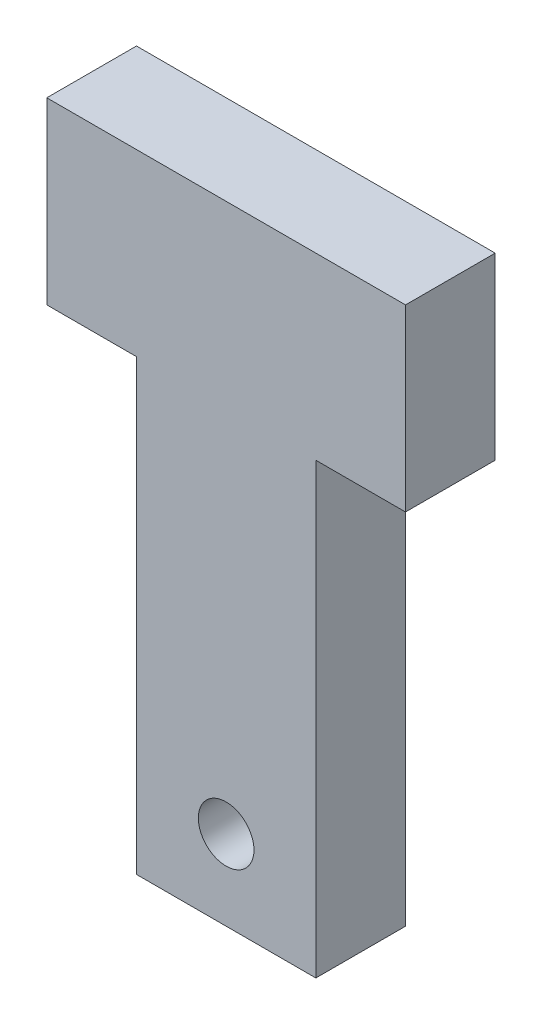
ISO-10303-21;
HEADER;
FILE_DESCRIPTION(('STEP AP214'),'2;1');
FILE_NAME('part.step','',(''),(''),'','','');
FILE_SCHEMA(('AUTOMOTIVE_DESIGN { 1 0 10303 214 1 1 1 1 }'));
ENDSEC;
DATA;
#1=APPLICATION_CONTEXT('core data for automotive mechanical design processes');
#2=APPLICATION_PROTOCOL_DEFINITION('international standard','automotive_design',2000,#1);
#3=PRODUCT_CONTEXT('',#1,'mechanical');
#4=PRODUCT('Part','Part','',(#3));
#5=PRODUCT_RELATED_PRODUCT_CATEGORY('part','',(#4));
#6=PRODUCT_DEFINITION_FORMATION('','',#4);
#7=PRODUCT_DEFINITION_CONTEXT('part definition',#1,'design');
#8=PRODUCT_DEFINITION('design','',#6,#7);
#9=PRODUCT_DEFINITION_SHAPE('','',#8);
#10=(LENGTH_UNIT() NAMED_UNIT(*) SI_UNIT(.MILLI.,.METRE.));
#11=(NAMED_UNIT(*) PLANE_ANGLE_UNIT() SI_UNIT($,.RADIAN.));
#12=(NAMED_UNIT(*) SI_UNIT($,.STERADIAN.) SOLID_ANGLE_UNIT());
#13=UNCERTAINTY_MEASURE_WITH_UNIT(LENGTH_MEASURE(1.E-05),#10,'distance_accuracy_value','');
#14=(GEOMETRIC_REPRESENTATION_CONTEXT(3) GLOBAL_UNCERTAINTY_ASSIGNED_CONTEXT((#13)) GLOBAL_UNIT_ASSIGNED_CONTEXT((#10,
#11,#12)) REPRESENTATION_CONTEXT('',''));
#15=CARTESIAN_POINT('',(0.,0.,0.));
#16=DIRECTION('',(0.,0.,1.));
#17=DIRECTION('',(1.,0.,0.));
#18=AXIS2_PLACEMENT_3D('',#15,#16,#17);
#19=CARTESIAN_POINT('',(0.,0.,5.));
#20=DIRECTION('',(0.,0.,-1.));
#21=DIRECTION('',(-1.,0.,0.));
#22=AXIS2_PLACEMENT_3D('',#19,#20,#21);
#23=PLANE('',#22);
#24=DIRECTION('',(0.,-1.,0.));
#25=VECTOR('',#24,1.);
#26=CARTESIAN_POINT('',(-10.,5.,5.));
#27=LINE('',#26,#25);
#28=CARTESIAN_POINT('',(-10.,5.,5.));
#29=VERTEX_POINT('',#28);
#30=CARTESIAN_POINT('',(-10.,-5.,5.));
#31=VERTEX_POINT('',#30);
#32=EDGE_CURVE('E145',#29,#31,#27,.T.);
#33=ORIENTED_EDGE('',*,*,#32,.T.);
#34=DIRECTION('',(1.,0.,0.));
#35=VECTOR('',#34,1.);
#36=CARTESIAN_POINT('',(-5.,-5.,5.));
#37=LINE('',#36,#35);
#38=CARTESIAN_POINT('',(-5.,-5.,5.));
#39=VERTEX_POINT('',#38);
#40=EDGE_CURVE('E93',#31,#39,#37,.T.);
#41=ORIENTED_EDGE('',*,*,#40,.T.);
#42=DIRECTION('',(0.,-1.,0.));
#43=VECTOR('',#42,1.);
#44=CARTESIAN_POINT('',(-5.,-30.,5.));
#45=LINE('',#44,#43);
#46=CARTESIAN_POINT('',(-5.,-30.,5.));
#47=VERTEX_POINT('',#46);
#48=EDGE_CURVE('E160',#39,#47,#45,.T.);
#49=ORIENTED_EDGE('',*,*,#48,.T.);
#50=DIRECTION('',(1.,0.,0.));
#51=VECTOR('',#50,1.);
#52=CARTESIAN_POINT('',(5.,-30.,5.));
#53=LINE('',#52,#51);
#54=CARTESIAN_POINT('',(5.,-30.,5.));
#55=VERTEX_POINT('',#54);
#56=EDGE_CURVE('E173',#47,#55,#53,.T.);
#57=ORIENTED_EDGE('',*,*,#56,.T.);
#58=DIRECTION('',(0.,1.,0.));
#59=VECTOR('',#58,1.);
#60=CARTESIAN_POINT('',(5.,-30.,5.));
#61=LINE('',#60,#59);
#62=CARTESIAN_POINT('',(5.,-5.,5.));
#63=VERTEX_POINT('',#62);
#64=EDGE_CURVE('E112',#55,#63,#61,.T.);
#65=ORIENTED_EDGE('',*,*,#64,.T.);
#66=DIRECTION('',(1.,0.,0.));
#67=VECTOR('',#66,1.);
#68=CARTESIAN_POINT('',(10.,-5.,5.));
#69=LINE('',#68,#67);
#70=CARTESIAN_POINT('',(10.,-5.,5.));
#71=VERTEX_POINT('',#70);
#72=EDGE_CURVE('E106',#63,#71,#69,.T.);
#73=ORIENTED_EDGE('',*,*,#72,.T.);
#74=DIRECTION('',(0.,1.,0.));
#75=VECTOR('',#74,1.);
#76=CARTESIAN_POINT('',(10.,5.,5.));
#77=LINE('',#76,#75);
#78=CARTESIAN_POINT('',(10.,5.,5.));
#79=VERTEX_POINT('',#78);
#80=EDGE_CURVE('E110',#71,#79,#77,.T.);
#81=ORIENTED_EDGE('',*,*,#80,.T.);
#82=DIRECTION('',(-1.,0.,0.));
#83=VECTOR('',#82,1.);
#84=CARTESIAN_POINT('',(10.,5.,5.));
#85=LINE('',#84,#83);
#86=EDGE_CURVE('E50',#79,#29,#85,.T.);
#87=ORIENTED_EDGE('',*,*,#86,.T.);
#88=EDGE_LOOP('',(#33,#41,#49,#57,#65,#73,#81,#87));
#89=FACE_BOUND('',#88,.T.);
#90=CARTESIAN_POINT('',(0.,-25.55,5.));
#91=DIRECTION('',(0.,0.,1.));
#92=DIRECTION('',(1.,0.,0.));
#93=AXIS2_PLACEMENT_3D('',#90,#91,#92);
#94=CIRCLE('',#93,1.55);
#95=CARTESIAN_POINT('',(1.55,-25.55,5.));
#96=VERTEX_POINT('',#95);
#97=EDGE_CURVE('E134',#96,#96,#94,.T.);
#98=ORIENTED_EDGE('',*,*,#97,.F.);
#99=EDGE_LOOP('',(#98));
#100=FACE_BOUND('',#99,.T.);
#101=ADVANCED_FACE('F33',(#89,#100),#23,.F.);
#102=CARTESIAN_POINT('',(0.,0.,0.));
#103=DIRECTION('',(0.,0.,-1.));
#104=DIRECTION('',(-1.,0.,0.));
#105=AXIS2_PLACEMENT_3D('',#102,#103,#104);
#106=PLANE('',#105);
#107=DIRECTION('',(0.,-1.,0.));
#108=VECTOR('',#107,1.);
#109=CARTESIAN_POINT('',(-10.,5.,0.));
#110=LINE('',#109,#108);
#111=CARTESIAN_POINT('',(-10.,5.,0.));
#112=VERTEX_POINT('',#111);
#113=CARTESIAN_POINT('',(-10.,-5.,0.));
#114=VERTEX_POINT('',#113);
#115=EDGE_CURVE('E130',#112,#114,#110,.T.);
#116=ORIENTED_EDGE('',*,*,#115,.F.);
#117=DIRECTION('',(-1.,0.,0.));
#118=VECTOR('',#117,1.);
#119=CARTESIAN_POINT('',(10.,5.,0.));
#120=LINE('',#119,#118);
#121=CARTESIAN_POINT('',(10.,5.,0.));
#122=VERTEX_POINT('',#121);
#123=EDGE_CURVE('E85',#122,#112,#120,.T.);
#124=ORIENTED_EDGE('',*,*,#123,.F.);
#125=DIRECTION('',(0.,1.,0.));
#126=VECTOR('',#125,1.);
#127=CARTESIAN_POINT('',(10.,5.,0.));
#128=LINE('',#127,#126);
#129=CARTESIAN_POINT('',(10.,-5.,0.));
#130=VERTEX_POINT('',#129);
#131=EDGE_CURVE('E79',#130,#122,#128,.T.);
#132=ORIENTED_EDGE('',*,*,#131,.F.);
#133=DIRECTION('',(1.,0.,0.));
#134=VECTOR('',#133,1.);
#135=CARTESIAN_POINT('',(10.,-5.,0.));
#136=LINE('',#135,#134);
#137=CARTESIAN_POINT('',(5.,-5.,0.));
#138=VERTEX_POINT('',#137);
#139=EDGE_CURVE('E120',#138,#130,#136,.T.);
#140=ORIENTED_EDGE('',*,*,#139,.F.);
#141=DIRECTION('',(0.,1.,0.));
#142=VECTOR('',#141,1.);
#143=CARTESIAN_POINT('',(5.,-30.,0.));
#144=LINE('',#143,#142);
#145=CARTESIAN_POINT('',(5.,-30.,0.));
#146=VERTEX_POINT('',#145);
#147=EDGE_CURVE('E140',#146,#138,#144,.T.);
#148=ORIENTED_EDGE('',*,*,#147,.F.);
#149=DIRECTION('',(1.,0.,0.));
#150=VECTOR('',#149,1.);
#151=CARTESIAN_POINT('',(5.,-30.,0.));
#152=LINE('',#151,#150);
#153=CARTESIAN_POINT('',(-5.,-30.,0.));
#154=VERTEX_POINT('',#153);
#155=EDGE_CURVE('E138',#154,#146,#152,.T.);
#156=ORIENTED_EDGE('',*,*,#155,.F.);
#157=DIRECTION('',(0.,-1.,0.));
#158=VECTOR('',#157,1.);
#159=CARTESIAN_POINT('',(-5.,-30.,0.));
#160=LINE('',#159,#158);
#161=CARTESIAN_POINT('',(-5.,-5.,0.));
#162=VERTEX_POINT('',#161);
#163=EDGE_CURVE('E136',#162,#154,#160,.T.);
#164=ORIENTED_EDGE('',*,*,#163,.F.);
#165=DIRECTION('',(1.,0.,0.));
#166=VECTOR('',#165,1.);
#167=CARTESIAN_POINT('',(-5.,-5.,0.));
#168=LINE('',#167,#166);
#169=EDGE_CURVE('E133',#114,#162,#168,.T.);
#170=ORIENTED_EDGE('',*,*,#169,.F.);
#171=EDGE_LOOP('',(#116,#124,#132,#140,#148,#156,#164,#170));
#172=FACE_BOUND('',#171,.T.);
#173=CARTESIAN_POINT('',(0.,-25.55,0.));
#174=DIRECTION('',(0.,0.,1.));
#175=DIRECTION('',(1.,0.,0.));
#176=AXIS2_PLACEMENT_3D('',#173,#174,#175);
#177=CIRCLE('',#176,1.55);
#178=CARTESIAN_POINT('',(1.55,-25.55,0.));
#179=VERTEX_POINT('',#178);
#180=EDGE_CURVE('E179',#179,#179,#177,.T.);
#181=ORIENTED_EDGE('',*,*,#180,.T.);
#182=EDGE_LOOP('',(#181));
#183=FACE_BOUND('',#182,.T.);
#184=ADVANCED_FACE('F164',(#172,#183),#106,.T.);
#185=CARTESIAN_POINT('',(-10.,5.,5.));
#186=DIRECTION('',(1.,0.,0.));
#187=DIRECTION('',(0.,0.,-1.));
#188=AXIS2_PLACEMENT_3D('',#185,#186,#187);
#189=PLANE('',#188);
#190=ORIENTED_EDGE('',*,*,#115,.T.);
#191=DIRECTION('',(0.,0.,-1.));
#192=VECTOR('',#191,1.);
#193=CARTESIAN_POINT('',(-10.,-5.,5.));
#194=LINE('',#193,#192);
#195=EDGE_CURVE('E11',#31,#114,#194,.T.);
#196=ORIENTED_EDGE('',*,*,#195,.F.);
#197=ORIENTED_EDGE('',*,*,#32,.F.);
#198=DIRECTION('',(0.,0.,-1.));
#199=VECTOR('',#198,1.);
#200=CARTESIAN_POINT('',(-10.,5.,5.));
#201=LINE('',#200,#199);
#202=EDGE_CURVE('E126',#29,#112,#201,.T.);
#203=ORIENTED_EDGE('',*,*,#202,.T.);
#204=EDGE_LOOP('',(#190,#196,#197,#203));
#205=FACE_BOUND('',#204,.T.);
#206=ADVANCED_FACE('F35',(#205),#189,.F.);
#207=CARTESIAN_POINT('',(-5.,-5.,5.));
#208=DIRECTION('',(0.,1.,0.));
#209=DIRECTION('',(-1.,0.,0.));
#210=AXIS2_PLACEMENT_3D('',#207,#208,#209);
#211=PLANE('',#210);
#212=ORIENTED_EDGE('',*,*,#169,.T.);
#213=DIRECTION('',(0.,0.,-1.));
#214=VECTOR('',#213,1.);
#215=CARTESIAN_POINT('',(-5.,-5.,5.));
#216=LINE('',#215,#214);
#217=EDGE_CURVE('E42',#39,#162,#216,.T.);
#218=ORIENTED_EDGE('',*,*,#217,.F.);
#219=ORIENTED_EDGE('',*,*,#40,.F.);
#220=ORIENTED_EDGE('',*,*,#195,.T.);
#221=EDGE_LOOP('',(#212,#218,#219,#220));
#222=FACE_BOUND('',#221,.T.);
#223=ADVANCED_FACE('F207',(#222),#211,.F.);
#224=CARTESIAN_POINT('',(-5.,-30.,5.));
#225=DIRECTION('',(1.,0.,0.));
#226=DIRECTION('',(0.,1.,0.));
#227=AXIS2_PLACEMENT_3D('',#224,#225,#226);
#228=PLANE('',#227);
#229=ORIENTED_EDGE('',*,*,#163,.T.);
#230=DIRECTION('',(0.,0.,-1.));
#231=VECTOR('',#230,1.);
#232=CARTESIAN_POINT('',(-5.,-30.,5.));
#233=LINE('',#232,#231);
#234=EDGE_CURVE('E152',#47,#154,#233,.T.);
#235=ORIENTED_EDGE('',*,*,#234,.F.);
#236=ORIENTED_EDGE('',*,*,#48,.F.);
#237=ORIENTED_EDGE('',*,*,#217,.T.);
#238=EDGE_LOOP('',(#229,#235,#236,#237));
#239=FACE_BOUND('',#238,.T.);
#240=ADVANCED_FACE('F158',(#239),#228,.F.);
#241=CARTESIAN_POINT('',(5.,-30.,5.));
#242=DIRECTION('',(0.,1.,0.));
#243=DIRECTION('',(0.,0.,1.));
#244=AXIS2_PLACEMENT_3D('',#241,#242,#243);
#245=PLANE('',#244);
#246=ORIENTED_EDGE('',*,*,#155,.T.);
#247=DIRECTION('',(0.,0.,-1.));
#248=VECTOR('',#247,1.);
#249=CARTESIAN_POINT('',(5.,-30.,5.));
#250=LINE('',#249,#248);
#251=EDGE_CURVE('E149',#55,#146,#250,.T.);
#252=ORIENTED_EDGE('',*,*,#251,.F.);
#253=ORIENTED_EDGE('',*,*,#56,.F.);
#254=ORIENTED_EDGE('',*,*,#234,.T.);
#255=EDGE_LOOP('',(#246,#252,#253,#254));
#256=FACE_BOUND('',#255,.T.);
#257=ADVANCED_FACE('F169',(#256),#245,.F.);
#258=CARTESIAN_POINT('',(5.,-30.,5.));
#259=DIRECTION('',(-1.,0.,0.));
#260=DIRECTION('',(0.,-1.,0.));
#261=AXIS2_PLACEMENT_3D('',#258,#259,#260);
#262=PLANE('',#261);
#263=ORIENTED_EDGE('',*,*,#147,.T.);
#264=DIRECTION('',(0.,0.,-1.));
#265=VECTOR('',#264,1.);
#266=CARTESIAN_POINT('',(5.,-5.,5.));
#267=LINE('',#266,#265);
#268=EDGE_CURVE('E121',#63,#138,#267,.T.);
#269=ORIENTED_EDGE('',*,*,#268,.F.);
#270=ORIENTED_EDGE('',*,*,#64,.F.);
#271=ORIENTED_EDGE('',*,*,#251,.T.);
#272=EDGE_LOOP('',(#263,#269,#270,#271));
#273=FACE_BOUND('',#272,.T.);
#274=ADVANCED_FACE('F172',(#273),#262,.F.);
#275=CARTESIAN_POINT('',(10.,-5.,5.));
#276=DIRECTION('',(0.,1.,0.));
#277=DIRECTION('',(-1.,0.,0.));
#278=AXIS2_PLACEMENT_3D('',#275,#276,#277);
#279=PLANE('',#278);
#280=ORIENTED_EDGE('',*,*,#139,.T.);
#281=DIRECTION('',(0.,0.,-1.));
#282=VECTOR('',#281,1.);
#283=CARTESIAN_POINT('',(10.,-5.,5.));
#284=LINE('',#283,#282);
#285=EDGE_CURVE('E117',#71,#130,#284,.T.);
#286=ORIENTED_EDGE('',*,*,#285,.F.);
#287=ORIENTED_EDGE('',*,*,#72,.F.);
#288=ORIENTED_EDGE('',*,*,#268,.T.);
#289=EDGE_LOOP('',(#280,#286,#287,#288));
#290=FACE_BOUND('',#289,.T.);
#291=ADVANCED_FACE('F118',(#290),#279,.F.);
#292=CARTESIAN_POINT('',(10.,5.,5.));
#293=DIRECTION('',(-1.,0.,0.));
#294=DIRECTION('',(0.,0.,1.));
#295=AXIS2_PLACEMENT_3D('',#292,#293,#294);
#296=PLANE('',#295);
#297=ORIENTED_EDGE('',*,*,#131,.T.);
#298=DIRECTION('',(0.,0.,-1.));
#299=VECTOR('',#298,1.);
#300=CARTESIAN_POINT('',(10.,5.,5.));
#301=LINE('',#300,#299);
#302=EDGE_CURVE('E122',#79,#122,#301,.T.);
#303=ORIENTED_EDGE('',*,*,#302,.F.);
#304=ORIENTED_EDGE('',*,*,#80,.F.);
#305=ORIENTED_EDGE('',*,*,#285,.T.);
#306=EDGE_LOOP('',(#297,#303,#304,#305));
#307=FACE_BOUND('',#306,.T.);
#308=ADVANCED_FACE('F124',(#307),#296,.F.);
#309=CARTESIAN_POINT('',(10.,5.,5.));
#310=DIRECTION('',(0.,-1.,0.));
#311=DIRECTION('',(0.,0.,-1.));
#312=AXIS2_PLACEMENT_3D('',#309,#310,#311);
#313=PLANE('',#312);
#314=ORIENTED_EDGE('',*,*,#123,.T.);
#315=ORIENTED_EDGE('',*,*,#202,.F.);
#316=ORIENTED_EDGE('',*,*,#86,.F.);
#317=ORIENTED_EDGE('',*,*,#302,.T.);
#318=EDGE_LOOP('',(#314,#315,#316,#317));
#319=FACE_BOUND('',#318,.T.);
#320=ADVANCED_FACE('F195',(#319),#313,.F.);
#321=CARTESIAN_POINT('',(0.,-25.55,5.));
#322=DIRECTION('',(0.,0.,-1.));
#323=DIRECTION('',(-1.,0.,0.));
#324=AXIS2_PLACEMENT_3D('',#321,#322,#323);
#325=CYLINDRICAL_SURFACE('',#324,1.55);
#326=ORIENTED_EDGE('',*,*,#97,.T.);
#327=EDGE_LOOP('',(#326));
#328=FACE_BOUND('',#327,.T.);
#329=ORIENTED_EDGE('',*,*,#180,.F.);
#330=EDGE_LOOP('',(#329));
#331=FACE_BOUND('',#330,.T.);
#332=ADVANCED_FACE('F185',(#328,#331),#325,.F.);
#333=CLOSED_SHELL('',(#101,#184,#206,#223,#240,#257,#274,#291,#308,#320,#332));
#334=MANIFOLD_SOLID_BREP('B2',#333);
#335=ADVANCED_BREP_SHAPE_REPRESENTATION('',(#18,#334),#14);
#336=SHAPE_DEFINITION_REPRESENTATION(#9,#335);
ENDSEC;
END-ISO-10303-21;
